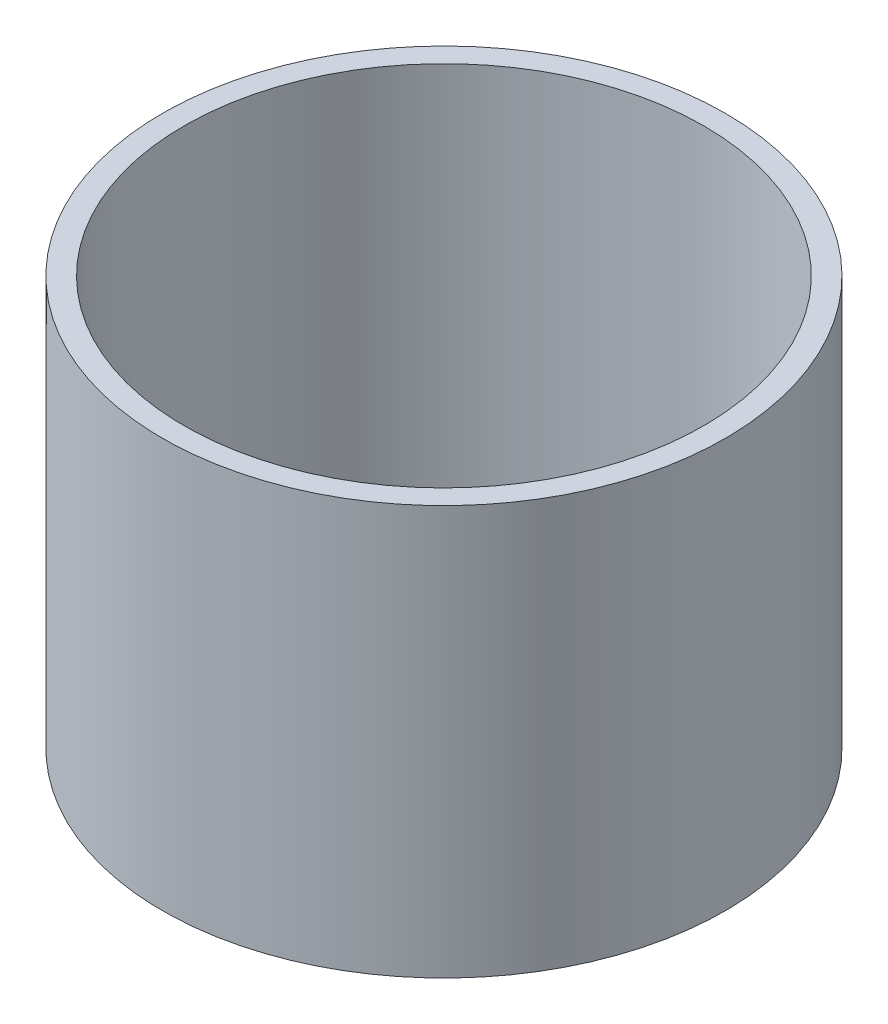
ISO-10303-21;
HEADER;
FILE_DESCRIPTION(('STEP AP214'),'2;1');
FILE_NAME('part.step','',(''),(''),'','','');
FILE_SCHEMA(('AUTOMOTIVE_DESIGN { 1 0 10303 214 1 1 1 1 }'));
ENDSEC;
DATA;
#1=APPLICATION_CONTEXT('core data for automotive mechanical design processes');
#2=APPLICATION_PROTOCOL_DEFINITION('international standard','automotive_design',2000,#1);
#3=PRODUCT_CONTEXT('',#1,'mechanical');
#4=PRODUCT('Part','Part','',(#3));
#5=PRODUCT_RELATED_PRODUCT_CATEGORY('part','',(#4));
#6=PRODUCT_DEFINITION_FORMATION('','',#4);
#7=PRODUCT_DEFINITION_CONTEXT('part definition',#1,'design');
#8=PRODUCT_DEFINITION('design','',#6,#7);
#9=PRODUCT_DEFINITION_SHAPE('','',#8);
#10=(LENGTH_UNIT() NAMED_UNIT(*) SI_UNIT(.MILLI.,.METRE.));
#11=(NAMED_UNIT(*) PLANE_ANGLE_UNIT() SI_UNIT($,.RADIAN.));
#12=(NAMED_UNIT(*) SI_UNIT($,.STERADIAN.) SOLID_ANGLE_UNIT());
#13=UNCERTAINTY_MEASURE_WITH_UNIT(LENGTH_MEASURE(1.E-05),#10,'distance_accuracy_value','');
#14=(GEOMETRIC_REPRESENTATION_CONTEXT(3) GLOBAL_UNCERTAINTY_ASSIGNED_CONTEXT((#13)) GLOBAL_UNIT_ASSIGNED_CONTEXT((#10,
#11,#12)) REPRESENTATION_CONTEXT('',''));
#15=CARTESIAN_POINT('',(0.,0.,0.));
#16=DIRECTION('',(0.,0.,1.));
#17=DIRECTION('',(1.,0.,0.));
#18=AXIS2_PLACEMENT_3D('',#15,#16,#17);
#19=CARTESIAN_POINT('',(0.,90.,0.));
#20=DIRECTION('',(0.,1.,0.));
#21=DIRECTION('',(0.,0.,1.));
#22=AXIS2_PLACEMENT_3D('',#19,#20,#21);
#23=PLANE('',#22);
#24=CARTESIAN_POINT('',(0.,90.,0.));
#25=DIRECTION('',(0.,1.,0.));
#26=DIRECTION('',(0.,0.,1.));
#27=AXIS2_PLACEMENT_3D('',#24,#25,#26);
#28=CIRCLE('',#27,61.9125);
#29=CARTESIAN_POINT('',(0.,90.,-61.9125));
#30=VERTEX_POINT('',#29);
#31=EDGE_CURVE('E10',#30,#30,#28,.T.);
#32=ORIENTED_EDGE('',*,*,#31,.T.);
#33=EDGE_LOOP('',(#32));
#34=FACE_BOUND('',#33,.T.);
#35=CARTESIAN_POINT('',(0.,90.,0.));
#36=DIRECTION('',(0.,1.,0.));
#37=DIRECTION('',(0.,0.,1.));
#38=AXIS2_PLACEMENT_3D('',#35,#36,#37);
#39=CIRCLE('',#38,57.15);
#40=CARTESIAN_POINT('',(0.,90.,-57.15));
#41=VERTEX_POINT('',#40);
#42=EDGE_CURVE('E54',#41,#41,#39,.T.);
#43=ORIENTED_EDGE('',*,*,#42,.F.);
#44=EDGE_LOOP('',(#43));
#45=FACE_BOUND('',#44,.T.);
#46=ADVANCED_FACE('F41',(#34,#45),#23,.T.);
#47=CARTESIAN_POINT('',(0.,0.,0.));
#48=DIRECTION('',(0.,1.,0.));
#49=DIRECTION('',(0.,0.,1.));
#50=AXIS2_PLACEMENT_3D('',#47,#48,#49);
#51=PLANE('',#50);
#52=CARTESIAN_POINT('',(0.,0.,0.));
#53=DIRECTION('',(0.,1.,0.));
#54=DIRECTION('',(0.,0.,1.));
#55=AXIS2_PLACEMENT_3D('',#52,#53,#54);
#56=CIRCLE('',#55,61.9125);
#57=CARTESIAN_POINT('',(0.,0.,-61.9125));
#58=VERTEX_POINT('',#57);
#59=EDGE_CURVE('E45',#58,#58,#56,.T.);
#60=ORIENTED_EDGE('',*,*,#59,.F.);
#61=EDGE_LOOP('',(#60));
#62=FACE_BOUND('',#61,.T.);
#63=CARTESIAN_POINT('',(0.,0.,0.));
#64=DIRECTION('',(0.,1.,0.));
#65=DIRECTION('',(0.,0.,1.));
#66=AXIS2_PLACEMENT_3D('',#63,#64,#65);
#67=CIRCLE('',#66,57.15);
#68=CARTESIAN_POINT('',(0.,0.,-57.15));
#69=VERTEX_POINT('',#68);
#70=EDGE_CURVE('E56',#69,#69,#67,.T.);
#71=ORIENTED_EDGE('',*,*,#70,.T.);
#72=EDGE_LOOP('',(#71));
#73=FACE_BOUND('',#72,.T.);
#74=ADVANCED_FACE('F68',(#62,#73),#51,.F.);
#75=CARTESIAN_POINT('',(0.,90.,0.));
#76=DIRECTION('',(0.,-1.,0.));
#77=DIRECTION('',(0.,0.,-1.));
#78=AXIS2_PLACEMENT_3D('',#75,#76,#77);
#79=CYLINDRICAL_SURFACE('',#78,61.9125);
#80=CARTESIAN_POINT('',(0.,90.,-61.9125));
#81=CARTESIAN_POINT('',(0.,89.0625,-61.9125));
#82=CARTESIAN_POINT('',(0.,88.125,-61.9125));
#83=CARTESIAN_POINT('',(0.,86.25,-61.9125));
#84=CARTESIAN_POINT('',(0.,85.3125,-61.9125));
#85=CARTESIAN_POINT('',(0.,83.4375,-61.9125));
#86=CARTESIAN_POINT('',(0.,82.5,-61.9125));
#87=CARTESIAN_POINT('',(0.,80.625,-61.9125));
#88=CARTESIAN_POINT('',(0.,79.6875,-61.9125));
#89=CARTESIAN_POINT('',(0.,77.8125,-61.9125));
#90=CARTESIAN_POINT('',(0.,76.875,-61.9125));
#91=CARTESIAN_POINT('',(0.,75.,-61.9125));
#92=CARTESIAN_POINT('',(0.,74.0625,-61.9125));
#93=CARTESIAN_POINT('',(0.,72.1875,-61.9125));
#94=CARTESIAN_POINT('',(0.,71.25,-61.9125));
#95=CARTESIAN_POINT('',(0.,69.375,-61.9125));
#96=CARTESIAN_POINT('',(0.,68.4375,-61.9125));
#97=CARTESIAN_POINT('',(0.,66.5625,-61.9125));
#98=CARTESIAN_POINT('',(0.,65.625,-61.9125));
#99=CARTESIAN_POINT('',(0.,63.75,-61.9125));
#100=CARTESIAN_POINT('',(0.,62.8125,-61.9125));
#101=CARTESIAN_POINT('',(0.,60.9375,-61.9125));
#102=CARTESIAN_POINT('',(0.,60.,-61.9125));
#103=CARTESIAN_POINT('',(0.,58.125,-61.9125));
#104=CARTESIAN_POINT('',(0.,57.1875,-61.9125));
#105=CARTESIAN_POINT('',(0.,55.3125,-61.9125));
#106=CARTESIAN_POINT('',(0.,54.375,-61.9125));
#107=CARTESIAN_POINT('',(0.,52.5,-61.9125));
#108=CARTESIAN_POINT('',(0.,51.5625,-61.9125));
#109=CARTESIAN_POINT('',(0.,49.6875,-61.9125));
#110=CARTESIAN_POINT('',(0.,48.75,-61.9125));
#111=CARTESIAN_POINT('',(0.,46.875,-61.9125));
#112=CARTESIAN_POINT('',(0.,45.9375,-61.9125));
#113=CARTESIAN_POINT('',(0.,44.0625,-61.9125));
#114=CARTESIAN_POINT('',(0.,43.125,-61.9125));
#115=CARTESIAN_POINT('',(0.,41.25,-61.9125));
#116=CARTESIAN_POINT('',(0.,40.3125,-61.9125));
#117=CARTESIAN_POINT('',(0.,38.4375,-61.9125));
#118=CARTESIAN_POINT('',(0.,37.5,-61.9125));
#119=CARTESIAN_POINT('',(0.,35.625,-61.9125));
#120=CARTESIAN_POINT('',(0.,34.6875,-61.9125));
#121=CARTESIAN_POINT('',(0.,32.8125,-61.9125));
#122=CARTESIAN_POINT('',(0.,31.875,-61.9125));
#123=CARTESIAN_POINT('',(0.,30.,-61.9125));
#124=CARTESIAN_POINT('',(0.,29.0625,-61.9125));
#125=CARTESIAN_POINT('',(0.,27.1875,-61.9125));
#126=CARTESIAN_POINT('',(0.,26.25,-61.9125));
#127=CARTESIAN_POINT('',(0.,24.375,-61.9125));
#128=CARTESIAN_POINT('',(0.,23.4375,-61.9125));
#129=CARTESIAN_POINT('',(0.,21.5625,-61.9125));
#130=CARTESIAN_POINT('',(0.,20.625,-61.9125));
#131=CARTESIAN_POINT('',(0.,18.75,-61.9125));
#132=CARTESIAN_POINT('',(0.,17.8125,-61.9125));
#133=CARTESIAN_POINT('',(0.,15.9375,-61.9125));
#134=CARTESIAN_POINT('',(0.,15.,-61.9125));
#135=CARTESIAN_POINT('',(0.,13.125,-61.9125));
#136=CARTESIAN_POINT('',(0.,12.1875,-61.9125));
#137=CARTESIAN_POINT('',(0.,10.3125,-61.9125));
#138=CARTESIAN_POINT('',(0.,9.37499999999999,-61.9125));
#139=CARTESIAN_POINT('',(0.,7.49999999999999,-61.9125));
#140=CARTESIAN_POINT('',(0.,6.56249999999999,-61.9125));
#141=CARTESIAN_POINT('',(0.,4.68749999999999,-61.9125));
#142=CARTESIAN_POINT('',(0.,3.74999999999998,-61.9125));
#143=CARTESIAN_POINT('',(0.,1.87499999999998,-61.9125));
#144=CARTESIAN_POINT('',(0.,0.937499999999986,-61.9125));
#145=CARTESIAN_POINT('',(0.,0.,-61.9125));
#146=B_SPLINE_CURVE_WITH_KNOTS('',3,(#80,#81,#82,#83,#84,#85,#86,#87,#88,#89,#90,#91,#92,#93,
#94,#95,#96,#97,#98,#99,#100,#101,#102,#103,#104,#105,#106,#107,#108,#109,#110,#111,#112,#113,
#114,#115,#116,#117,#118,#119,#120,#121,#122,#123,#124,#125,#126,#127,#128,#129,#130,#131,#132,
#133,#134,#135,#136,#137,#138,#139,#140,#141,#142,#143,#144,#145),.UNSPECIFIED.,.F.,.F.,(4,2,2,
2,2,2,2,2,2,2,2,2,2,2,2,2,2,2,2,2,2,2,2,2,2,2,2,2,2,2,2,2,4),(0.,2.8125,5.62499999999999,
8.43749999999999,11.25,14.0625,16.875,19.6875,22.5,25.3125,28.125,30.9375,33.75,36.5625,39.375,
42.1875,45.,47.8125,50.625,53.4375,56.25,59.0625,61.875,64.6875,67.5,70.3125,73.125,75.9375,
78.75,81.5625,84.375,87.1875,90.),.UNSPECIFIED.);
#147=EDGE_CURVE('BSEAM43',#30,#58,#146,.T.);
#148=ORIENTED_EDGE('',*,*,#31,.F.);
#149=ORIENTED_EDGE('',*,*,#59,.T.);
#150=ORIENTED_EDGE('',*,*,#147,.T.);
#151=ORIENTED_EDGE('',*,*,#147,.F.);
#152=EDGE_LOOP('',(#148,#150,#149,#151));
#153=FACE_BOUND('',#152,.T.);
#154=ADVANCED_FACE('F43',(#153),#79,.T.);
#155=CARTESIAN_POINT('',(0.,90.,0.));
#156=DIRECTION('',(0.,-1.,0.));
#157=DIRECTION('',(0.,0.,-1.));
#158=AXIS2_PLACEMENT_3D('',#155,#156,#157);
#159=CYLINDRICAL_SURFACE('',#158,57.15);
#160=CARTESIAN_POINT('',(0.,90.,-57.15));
#161=CARTESIAN_POINT('',(0.,89.0625,-57.15));
#162=CARTESIAN_POINT('',(0.,88.125,-57.15));
#163=CARTESIAN_POINT('',(0.,86.25,-57.15));
#164=CARTESIAN_POINT('',(0.,85.3125,-57.15));
#165=CARTESIAN_POINT('',(0.,83.4375,-57.15));
#166=CARTESIAN_POINT('',(0.,82.5,-57.15));
#167=CARTESIAN_POINT('',(0.,80.625,-57.15));
#168=CARTESIAN_POINT('',(0.,79.6875,-57.15));
#169=CARTESIAN_POINT('',(0.,77.8125,-57.15));
#170=CARTESIAN_POINT('',(0.,76.875,-57.15));
#171=CARTESIAN_POINT('',(0.,75.,-57.15));
#172=CARTESIAN_POINT('',(0.,74.0625,-57.15));
#173=CARTESIAN_POINT('',(0.,72.1875,-57.15));
#174=CARTESIAN_POINT('',(0.,71.25,-57.15));
#175=CARTESIAN_POINT('',(0.,69.375,-57.15));
#176=CARTESIAN_POINT('',(0.,68.4375,-57.15));
#177=CARTESIAN_POINT('',(0.,66.5625,-57.15));
#178=CARTESIAN_POINT('',(0.,65.625,-57.15));
#179=CARTESIAN_POINT('',(0.,63.75,-57.15));
#180=CARTESIAN_POINT('',(0.,62.8125,-57.15));
#181=CARTESIAN_POINT('',(0.,60.9375,-57.15));
#182=CARTESIAN_POINT('',(0.,60.,-57.15));
#183=CARTESIAN_POINT('',(0.,58.125,-57.15));
#184=CARTESIAN_POINT('',(0.,57.1875,-57.15));
#185=CARTESIAN_POINT('',(0.,55.3125,-57.15));
#186=CARTESIAN_POINT('',(0.,54.375,-57.15));
#187=CARTESIAN_POINT('',(0.,52.5,-57.15));
#188=CARTESIAN_POINT('',(0.,51.5625,-57.15));
#189=CARTESIAN_POINT('',(0.,49.6875,-57.15));
#190=CARTESIAN_POINT('',(0.,48.75,-57.15));
#191=CARTESIAN_POINT('',(0.,46.875,-57.15));
#192=CARTESIAN_POINT('',(0.,45.9375,-57.15));
#193=CARTESIAN_POINT('',(0.,44.0625,-57.15));
#194=CARTESIAN_POINT('',(0.,43.125,-57.15));
#195=CARTESIAN_POINT('',(0.,41.25,-57.15));
#196=CARTESIAN_POINT('',(0.,40.3125,-57.15));
#197=CARTESIAN_POINT('',(0.,38.4375,-57.15));
#198=CARTESIAN_POINT('',(0.,37.5,-57.15));
#199=CARTESIAN_POINT('',(0.,35.625,-57.15));
#200=CARTESIAN_POINT('',(0.,34.6875,-57.15));
#201=CARTESIAN_POINT('',(0.,32.8125,-57.15));
#202=CARTESIAN_POINT('',(0.,31.875,-57.15));
#203=CARTESIAN_POINT('',(0.,30.,-57.15));
#204=CARTESIAN_POINT('',(0.,29.0625,-57.15));
#205=CARTESIAN_POINT('',(0.,27.1875,-57.15));
#206=CARTESIAN_POINT('',(0.,26.25,-57.15));
#207=CARTESIAN_POINT('',(0.,24.375,-57.15));
#208=CARTESIAN_POINT('',(0.,23.4375,-57.15));
#209=CARTESIAN_POINT('',(0.,21.5625,-57.15));
#210=CARTESIAN_POINT('',(0.,20.625,-57.15));
#211=CARTESIAN_POINT('',(0.,18.75,-57.15));
#212=CARTESIAN_POINT('',(0.,17.8125,-57.15));
#213=CARTESIAN_POINT('',(0.,15.9375,-57.15));
#214=CARTESIAN_POINT('',(0.,15.,-57.15));
#215=CARTESIAN_POINT('',(0.,13.125,-57.15));
#216=CARTESIAN_POINT('',(0.,12.1875,-57.15));
#217=CARTESIAN_POINT('',(0.,10.3125,-57.15));
#218=CARTESIAN_POINT('',(0.,9.37499999999999,-57.15));
#219=CARTESIAN_POINT('',(0.,7.49999999999999,-57.15));
#220=CARTESIAN_POINT('',(0.,6.56249999999999,-57.15));
#221=CARTESIAN_POINT('',(0.,4.68749999999999,-57.15));
#222=CARTESIAN_POINT('',(0.,3.74999999999998,-57.15));
#223=CARTESIAN_POINT('',(0.,1.87499999999998,-57.15));
#224=CARTESIAN_POINT('',(0.,0.937499999999986,-57.15));
#225=CARTESIAN_POINT('',(0.,0.,-57.15));
#226=B_SPLINE_CURVE_WITH_KNOTS('',3,(#160,#161,#162,#163,#164,#165,#166,#167,#168,#169,#170,
#171,#172,#173,#174,#175,#176,#177,#178,#179,#180,#181,#182,#183,#184,#185,#186,#187,#188,#189,
#190,#191,#192,#193,#194,#195,#196,#197,#198,#199,#200,#201,#202,#203,#204,#205,#206,#207,#208,
#209,#210,#211,#212,#213,#214,#215,#216,#217,#218,#219,#220,#221,#222,#223,#224,#225),
.UNSPECIFIED.,.F.,.F.,(4,2,2,2,2,2,2,2,2,2,2,2,2,2,2,2,2,2,2,2,2,2,2,2,2,2,2,2,2,2,2,2,4),(0.,
2.81250000000001,5.62500000000001,8.43750000000001,11.25,14.0625,16.875,19.6875,22.5,25.3125,
28.125,30.9375,33.75,36.5625,39.375,42.1875,45.,47.8125,50.625,53.4375,56.25,59.0625,61.875,
64.6875,67.5,70.3125,73.125,75.9375,78.75,81.5625,84.375,87.1875,90.),.UNSPECIFIED.);
#227=EDGE_CURVE('BSEAM64',#41,#69,#226,.T.);
#228=ORIENTED_EDGE('',*,*,#42,.T.);
#229=ORIENTED_EDGE('',*,*,#70,.F.);
#230=ORIENTED_EDGE('',*,*,#227,.T.);
#231=ORIENTED_EDGE('',*,*,#227,.F.);
#232=EDGE_LOOP('',(#228,#230,#229,#231));
#233=FACE_BOUND('',#232,.T.);
#234=ADVANCED_FACE('F64',(#233),#159,.F.);
#235=CLOSED_SHELL('',(#46,#74,#154,#234));
#236=MANIFOLD_SOLID_BREP('B2',#235);
#237=ADVANCED_BREP_SHAPE_REPRESENTATION('',(#18,#236),#14);
#238=SHAPE_DEFINITION_REPRESENTATION(#9,#237);
ENDSEC;
END-ISO-10303-21;
